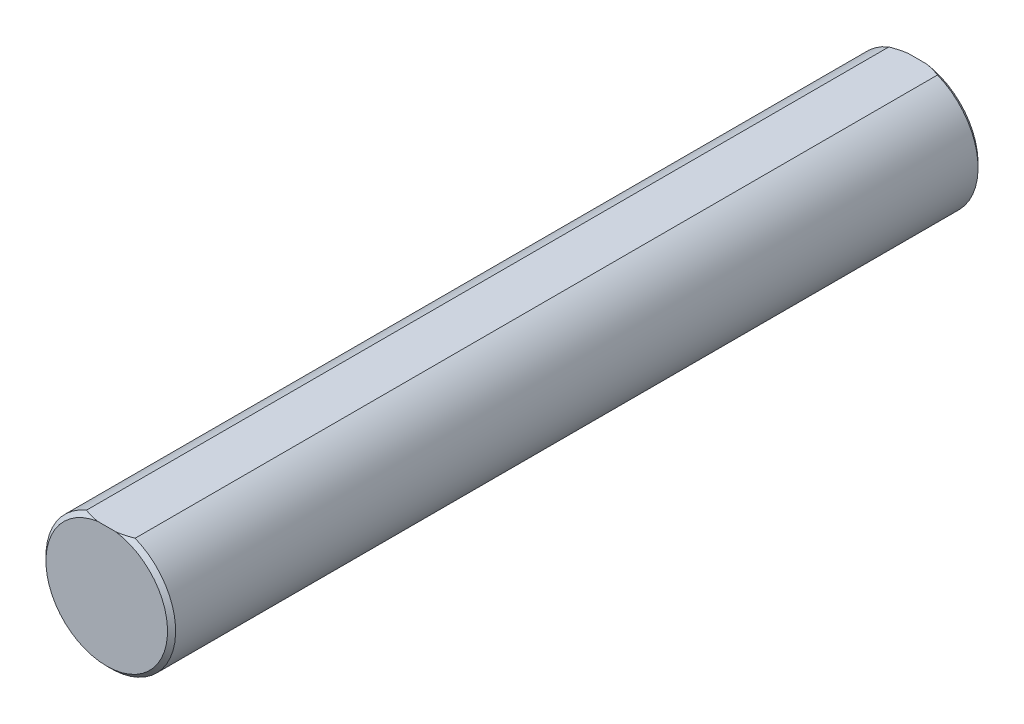
ISO-10303-21;
HEADER;
FILE_DESCRIPTION(('STEP AP214'),'2;1');
FILE_NAME('part.step','',(''),(''),'','','');
FILE_SCHEMA(('AUTOMOTIVE_DESIGN { 1 0 10303 214 1 1 1 1 }'));
ENDSEC;
DATA;
#1=APPLICATION_CONTEXT('core data for automotive mechanical design processes');
#2=APPLICATION_PROTOCOL_DEFINITION('international standard','automotive_design',2000,#1);
#3=PRODUCT_CONTEXT('',#1,'mechanical');
#4=PRODUCT('Part','Part','',(#3));
#5=PRODUCT_RELATED_PRODUCT_CATEGORY('part','',(#4));
#6=PRODUCT_DEFINITION_FORMATION('','',#4);
#7=PRODUCT_DEFINITION_CONTEXT('part definition',#1,'design');
#8=PRODUCT_DEFINITION('design','',#6,#7);
#9=PRODUCT_DEFINITION_SHAPE('','',#8);
#10=(LENGTH_UNIT() NAMED_UNIT(*) SI_UNIT(.MILLI.,.METRE.));
#11=(NAMED_UNIT(*) PLANE_ANGLE_UNIT() SI_UNIT($,.RADIAN.));
#12=(NAMED_UNIT(*) SI_UNIT($,.STERADIAN.) SOLID_ANGLE_UNIT());
#13=UNCERTAINTY_MEASURE_WITH_UNIT(LENGTH_MEASURE(1.E-05),#10,'distance_accuracy_value','');
#14=(GEOMETRIC_REPRESENTATION_CONTEXT(3) GLOBAL_UNCERTAINTY_ASSIGNED_CONTEXT((#13)) GLOBAL_UNIT_ASSIGNED_CONTEXT((#10,
#11,#12)) REPRESENTATION_CONTEXT('',''));
#15=CARTESIAN_POINT('',(0.,0.,0.));
#16=DIRECTION('',(0.,0.,1.));
#17=DIRECTION('',(1.,0.,0.));
#18=AXIS2_PLACEMENT_3D('',#15,#16,#17);
#19=CARTESIAN_POINT('',(0.,0.,50.));
#20=DIRECTION('',(0.,0.,-1.));
#21=DIRECTION('',(-1.,0.,0.));
#22=AXIS2_PLACEMENT_3D('',#19,#20,#21);
#23=CYLINDRICAL_SURFACE('',#22,4.);
#24=DIRECTION('',(0.,0.,1.));
#25=VECTOR('',#24,1.);
#26=CARTESIAN_POINT('',(1.5,3.70809924354783,0.));
#27=LINE('',#26,#25);
#28=CARTESIAN_POINT('',(1.5,3.70809924354783,0.250000000000014));
#29=VERTEX_POINT('',#28);
#30=CARTESIAN_POINT('',(1.5,3.70809924354783,49.75));
#31=VERTEX_POINT('',#30);
#32=EDGE_CURVE('E61',#29,#31,#27,.T.);
#33=ORIENTED_EDGE('',*,*,#32,.T.);
#34=CARTESIAN_POINT('',(0.,0.,49.75));
#35=DIRECTION('',(0.,0.,1.));
#36=DIRECTION('',(1.,0.,0.));
#37=AXIS2_PLACEMENT_3D('',#34,#35,#36);
#38=CIRCLE('',#37,4.);
#39=CARTESIAN_POINT('',(-1.5,3.70809924354783,49.75));
#40=VERTEX_POINT('',#39);
#41=EDGE_CURVE('E97',#31,#40,#38,.F.);
#42=ORIENTED_EDGE('',*,*,#41,.T.);
#43=DIRECTION('',(0.,0.,1.));
#44=VECTOR('',#43,1.);
#45=CARTESIAN_POINT('',(-1.5,3.70809924354783,0.));
#46=LINE('',#45,#44);
#47=CARTESIAN_POINT('',(-1.5,3.70809924354783,0.250000000000014));
#48=VERTEX_POINT('',#47);
#49=EDGE_CURVE('E111',#48,#40,#46,.T.);
#50=ORIENTED_EDGE('',*,*,#49,.F.);
#51=CARTESIAN_POINT('',(0.,0.,0.250000000000014));
#52=DIRECTION('',(0.,0.,1.));
#53=DIRECTION('',(1.,0.,0.));
#54=AXIS2_PLACEMENT_3D('',#51,#52,#53);
#55=CIRCLE('',#54,4.);
#56=EDGE_CURVE('E96',#48,#29,#55,.T.);
#57=ORIENTED_EDGE('',*,*,#56,.T.);
#58=EDGE_LOOP('',(#33,#42,#50,#57));
#59=FACE_BOUND('',#58,.T.);
#60=ADVANCED_FACE('F39',(#59),#23,.T.);
#61=CARTESIAN_POINT('',(0.,0.,50.));
#62=DIRECTION('',(0.,0.,1.));
#63=DIRECTION('',(1.,0.,0.));
#64=AXIS2_PLACEMENT_3D('',#61,#62,#63);
#65=PLANE('',#64);
#66=CARTESIAN_POINT('',(0.,0.,50.));
#67=DIRECTION('',(0.,0.,1.));
#68=DIRECTION('',(1.,0.,0.));
#69=AXIS2_PLACEMENT_3D('',#66,#67,#68);
#70=CIRCLE('',#69,3.74999999999999);
#71=CARTESIAN_POINT('',(-0.559016994374874,3.70809924354783,50.));
#72=VERTEX_POINT('',#71);
#73=CARTESIAN_POINT('',(0.559016994374874,3.70809924354783,50.));
#74=VERTEX_POINT('',#73);
#75=EDGE_CURVE('E102',#72,#74,#70,.T.);
#76=ORIENTED_EDGE('',*,*,#75,.T.);
#77=DIRECTION('',(-1.,0.,0.));
#78=VECTOR('',#77,1.);
#79=CARTESIAN_POINT('',(0.,3.70809924354783,50.));
#80=LINE('',#79,#78);
#81=EDGE_CURVE('E94',#74,#72,#80,.T.);
#82=ORIENTED_EDGE('',*,*,#81,.T.);
#83=EDGE_LOOP('',(#76,#82));
#84=FACE_BOUND('',#83,.T.);
#85=ADVANCED_FACE('F120',(#84),#65,.T.);
#86=CARTESIAN_POINT('',(0.,0.,0.));
#87=DIRECTION('',(0.,0.,1.));
#88=DIRECTION('',(1.,0.,0.));
#89=AXIS2_PLACEMENT_3D('',#86,#87,#88);
#90=PLANE('',#89);
#91=DIRECTION('',(-1.,0.,0.));
#92=VECTOR('',#91,1.);
#93=CARTESIAN_POINT('',(0.,3.70809924354783,0.));
#94=LINE('',#93,#92);
#95=CARTESIAN_POINT('',(0.559016994374833,3.70809924354783,0.));
#96=VERTEX_POINT('',#95);
#97=CARTESIAN_POINT('',(-0.559016994374833,3.70809924354783,0.));
#98=VERTEX_POINT('',#97);
#99=EDGE_CURVE('E85',#96,#98,#94,.T.);
#100=ORIENTED_EDGE('',*,*,#99,.F.);
#101=CARTESIAN_POINT('',(0.,0.,0.));
#102=DIRECTION('',(0.,0.,1.));
#103=DIRECTION('',(1.,0.,0.));
#104=AXIS2_PLACEMENT_3D('',#101,#102,#103);
#105=CIRCLE('',#104,3.74999999999998);
#106=EDGE_CURVE('E90',#96,#98,#105,.F.);
#107=ORIENTED_EDGE('',*,*,#106,.T.);
#108=EDGE_LOOP('',(#100,#107));
#109=FACE_BOUND('',#108,.T.);
#110=ADVANCED_FACE('F93',(#109),#90,.F.);
#111=CARTESIAN_POINT('',(0.,0.,50.));
#112=DIRECTION('',(0.,0.,-1.));
#113=DIRECTION('',(-1.,0.,0.));
#114=AXIS2_PLACEMENT_3D('',#111,#112,#113);
#115=CONICAL_SURFACE('',#114,3.74999999999999,0.785398163397441);
#116=ORIENTED_EDGE('',*,*,#41,.F.);
#117=CARTESIAN_POINT('',(1.5007,3.70809924354783,49.7497374473667));
#118=CARTESIAN_POINT('',(1.38093802701306,3.70809924354783,49.7946973497195));
#119=CARTESIAN_POINT('',(1.25951064862485,3.70809924354783,49.8356036287129));
#120=CARTESIAN_POINT('',(1.01348513615698,3.70809924354783,49.9076889443195));
#121=CARTESIAN_POINT('',(0.888879682496103,3.70809924354783,49.9388428179962));
#122=CARTESIAN_POINT('',(0.641715859304246,3.70809924354783,49.988660667804));
#123=CARTESIAN_POINT('',(0.519240449852508,3.70809924354783,50.0077266444236));
#124=CARTESIAN_POINT('',(0.273153981103614,3.70809924354783,50.0338627423759));
#125=CARTESIAN_POINT('',(0.149544565674343,3.70809924354783,50.0409481011472));
#126=CARTESIAN_POINT('',(-0.101919911953549,3.70809924354783,50.0427016259257));
#127=CARTESIAN_POINT('',(-0.22977818793777,3.70809924354783,50.0369449251457));
#128=CARTESIAN_POINT('',(-0.484413496958326,3.70809924354783,50.012547060152));
#129=CARTESIAN_POINT('',(-0.611188798321493,3.70809924354783,49.9938881616631));
#130=CARTESIAN_POINT('',(-0.867158643235847,3.70809924354783,49.9440030566342));
#131=CARTESIAN_POINT('',(-0.996263592339879,3.70809924354783,49.9123286219032));
#132=CARTESIAN_POINT('',(-1.25107228988779,3.70809924354783,49.8384443889638));
#133=CARTESIAN_POINT('',(-1.37678421773662,3.70809924354783,49.7962630193301));
#134=CARTESIAN_POINT('',(-1.5007,3.70809924354783,49.7497374473667));
#135=B_SPLINE_CURVE_WITH_KNOTS('',3,(#117,#118,#119,#120,#121,#122,#123,#124,#125,#126,#127,
#128,#129,#130,#131,#132,#133,#134),.UNSPECIFIED.,.F.,.F.,(4,2,2,2,2,2,2,2,4),(0.,
0.383900015383928,0.768782548715638,1.14008143514104,1.51090773230036,1.89418372718551,
2.27798759093812,2.67629389240741,3.07353398679821),.UNSPECIFIED.);
#136=EDGE_CURVE('E105',#31,#74,#135,.T.);
#137=ORIENTED_EDGE('',*,*,#136,.T.);
#138=ORIENTED_EDGE('',*,*,#75,.F.);
#139=EDGE_CURVE('E68',#72,#40,#135,.T.);
#140=ORIENTED_EDGE('',*,*,#139,.T.);
#141=EDGE_LOOP('',(#116,#137,#138,#140));
#142=FACE_BOUND('',#141,.T.);
#143=ADVANCED_FACE('F114',(#142),#115,.T.);
#144=CARTESIAN_POINT('',(0.,0.,0.250000000000014));
#145=DIRECTION('',(0.,0.,1.));
#146=DIRECTION('',(1.,0.,0.));
#147=AXIS2_PLACEMENT_3D('',#144,#145,#146);
#148=CONICAL_SURFACE('',#147,4.,0.785398163397455);
#149=ORIENTED_EDGE('',*,*,#56,.F.);
#150=CARTESIAN_POINT('',(-1.5007,3.70809924354783,0.250262552633279));
#151=CARTESIAN_POINT('',(-1.38093802701306,3.70809924354783,0.205302650280505));
#152=CARTESIAN_POINT('',(-1.25951064862484,3.70809924354783,0.164396371287061));
#153=CARTESIAN_POINT('',(-1.01348513615697,3.70809924354783,0.0923110556804764));
#154=CARTESIAN_POINT('',(-0.888879682496085,3.70809924354783,0.0611571820038527));
#155=CARTESIAN_POINT('',(-0.641715859304221,3.70809924354783,0.0113393321959573));
#156=CARTESIAN_POINT('',(-0.51924044985248,3.70809924354783,-0.00772664442363887));
#157=CARTESIAN_POINT('',(-0.27315398110358,3.70809924354783,-0.033862742375862));
#158=CARTESIAN_POINT('',(-0.149544565674306,3.70809924354783,-0.0409481011472356));
#159=CARTESIAN_POINT('',(0.101919911953586,3.70809924354783,-0.0427016259256573));
#160=CARTESIAN_POINT('',(0.229778187937805,3.70809924354783,-0.03694492514569));
#161=CARTESIAN_POINT('',(0.484413496958354,3.70809924354783,-0.0125470601519823));
#162=CARTESIAN_POINT('',(0.611188798321519,3.70809924354783,0.00611183833687938));
#163=CARTESIAN_POINT('',(0.867158643235865,3.70809924354783,0.055996943365825));
#164=CARTESIAN_POINT('',(0.996263592339893,3.70809924354783,0.0876713780967903));
#165=CARTESIAN_POINT('',(1.2510722898878,3.70809924354783,0.161555611036176));
#166=CARTESIAN_POINT('',(1.37678421773662,3.70809924354783,0.203736980669899));
#167=CARTESIAN_POINT('',(1.5007,3.70809924354783,0.250262552633279));
#168=B_SPLINE_CURVE_WITH_KNOTS('',3,(#150,#151,#152,#153,#154,#155,#156,#157,#158,#159,#160,
#161,#162,#163,#164,#165,#166,#167),.UNSPECIFIED.,.F.,.F.,(4,2,2,2,2,2,2,2,4),(0.,
0.383900015383938,0.768782548715658,1.14008143514107,1.5109077323004,1.89418372718554,
2.27798759093814,2.67629389240741,3.07353398679821),.UNSPECIFIED.);
#169=EDGE_CURVE('E11',#48,#98,#168,.T.);
#170=ORIENTED_EDGE('',*,*,#169,.T.);
#171=ORIENTED_EDGE('',*,*,#106,.F.);
#172=EDGE_CURVE('E45',#96,#29,#168,.T.);
#173=ORIENTED_EDGE('',*,*,#172,.T.);
#174=EDGE_LOOP('',(#149,#170,#171,#173));
#175=FACE_BOUND('',#174,.T.);
#176=ADVANCED_FACE('F42',(#175),#148,.T.);
#177=CARTESIAN_POINT('',(0.,3.70809924354783,0.));
#178=DIRECTION('',(0.,1.,0.));
#179=DIRECTION('',(0.,0.,1.));
#180=AXIS2_PLACEMENT_3D('',#177,#178,#179);
#181=PLANE('',#180);
#182=ORIENTED_EDGE('',*,*,#32,.F.);
#183=ORIENTED_EDGE('',*,*,#172,.F.);
#184=ORIENTED_EDGE('',*,*,#99,.T.);
#185=ORIENTED_EDGE('',*,*,#169,.F.);
#186=ORIENTED_EDGE('',*,*,#49,.T.);
#187=ORIENTED_EDGE('',*,*,#139,.F.);
#188=ORIENTED_EDGE('',*,*,#81,.F.);
#189=ORIENTED_EDGE('',*,*,#136,.F.);
#190=EDGE_LOOP('',(#182,#183,#184,#185,#186,#187,#188,#189));
#191=FACE_BOUND('',#190,.T.);
#192=ADVANCED_FACE('F84',(#191),#181,.T.);
#193=CLOSED_SHELL('',(#60,#85,#110,#143,#176,#192));
#194=MANIFOLD_SOLID_BREP('B2',#193);
#195=ADVANCED_BREP_SHAPE_REPRESENTATION('',(#18,#194),#14);
#196=SHAPE_DEFINITION_REPRESENTATION(#9,#195);
ENDSEC;
END-ISO-10303-21;
